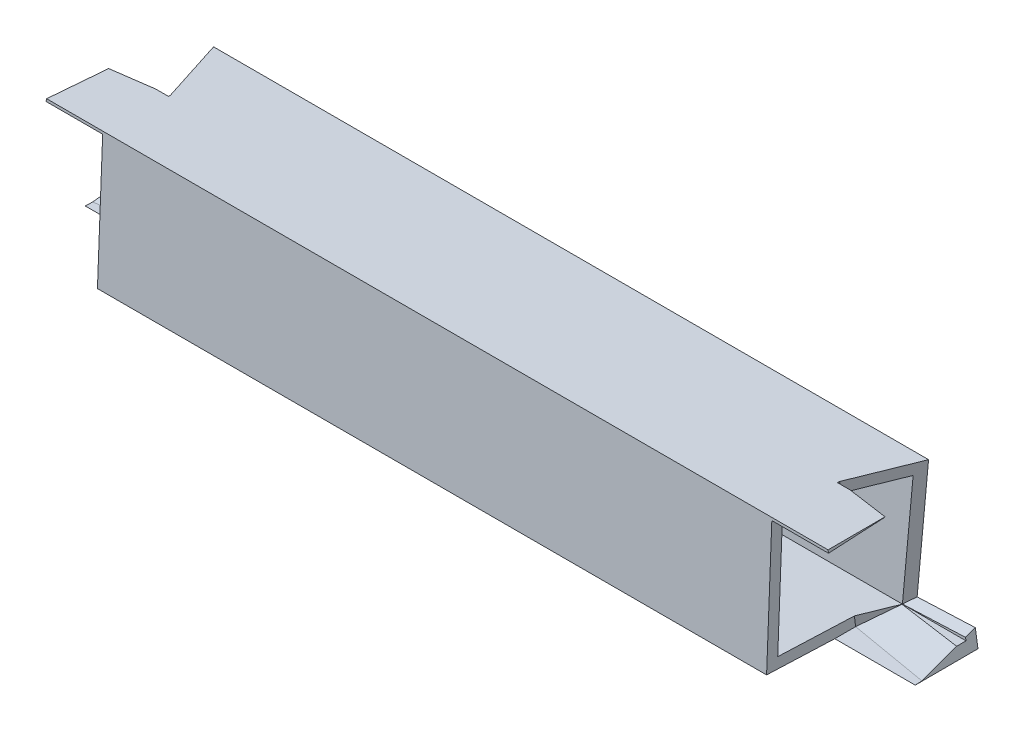
ISO-10303-21;
HEADER;
FILE_DESCRIPTION(('STEP AP214'),'2;1');
FILE_NAME('part.step','',(''),(''),'','','');
FILE_SCHEMA(('AUTOMOTIVE_DESIGN { 1 0 10303 214 1 1 1 1 }'));
ENDSEC;
DATA;
#1=APPLICATION_CONTEXT('core data for automotive mechanical design processes');
#2=APPLICATION_PROTOCOL_DEFINITION('international standard','automotive_design',2000,#1);
#3=PRODUCT_CONTEXT('',#1,'mechanical');
#4=PRODUCT('Part','Part','',(#3));
#5=PRODUCT_RELATED_PRODUCT_CATEGORY('part','',(#4));
#6=PRODUCT_DEFINITION_FORMATION('','',#4);
#7=PRODUCT_DEFINITION_CONTEXT('part definition',#1,'design');
#8=PRODUCT_DEFINITION('design','',#6,#7);
#9=PRODUCT_DEFINITION_SHAPE('','',#8);
#10=(LENGTH_UNIT() NAMED_UNIT(*) SI_UNIT(.MILLI.,.METRE.));
#11=(NAMED_UNIT(*) PLANE_ANGLE_UNIT() SI_UNIT($,.RADIAN.));
#12=(NAMED_UNIT(*) SI_UNIT($,.STERADIAN.) SOLID_ANGLE_UNIT());
#13=UNCERTAINTY_MEASURE_WITH_UNIT(LENGTH_MEASURE(1.E-05),#10,'distance_accuracy_value','');
#14=(GEOMETRIC_REPRESENTATION_CONTEXT(3) GLOBAL_UNCERTAINTY_ASSIGNED_CONTEXT((#13)) GLOBAL_UNIT_ASSIGNED_CONTEXT((#10,
#11,#12)) REPRESENTATION_CONTEXT('',''));
#15=CARTESIAN_POINT('',(0.,0.,0.));
#16=DIRECTION('',(0.,0.,1.));
#17=DIRECTION('',(1.,0.,0.));
#18=AXIS2_PLACEMENT_3D('',#15,#16,#17);
#19=CARTESIAN_POINT('',(60.0000000000013,-90.3909469228951,-1689.59313410964));
#20=DIRECTION('',(0.,0.999204051626855,-0.0398906406626591));
#21=DIRECTION('',(0.,0.0398906406626591,0.999204051626855));
#22=AXIS2_PLACEMENT_3D('',#19,#20,#21);
#23=PLANE('',#22);
#24=DIRECTION('',(0.,-0.0398906406626591,-0.999204051626855));
#25=VECTOR('',#24,1.);
#26=CARTESIAN_POINT('',(50.,-90.3909469228951,-1689.59313410964));
#27=LINE('',#26,#25);
#28=CARTESIAN_POINT('',(50.,-89.593134109642,-1669.60905307711));
#29=VERTEX_POINT('',#28);
#30=CARTESIAN_POINT('',(50.,-89.9999999999999,-1679.80046738785));
#31=VERTEX_POINT('',#30);
#32=EDGE_CURVE('E232',#29,#31,#27,.T.);
#33=ORIENTED_EDGE('',*,*,#32,.F.);
#34=DIRECTION('',(-1.,0.,0.));
#35=VECTOR('',#34,1.);
#36=CARTESIAN_POINT('',(60.0000000000013,-89.593134109642,-1669.6090530771));
#37=LINE('',#36,#35);
#38=CARTESIAN_POINT('',(-50.0000000000002,-89.593134109642,-1669.60905307711));
#39=VERTEX_POINT('',#38);
#40=EDGE_CURVE('E230',#29,#39,#37,.T.);
#41=ORIENTED_EDGE('',*,*,#40,.T.);
#42=DIRECTION('',(0.,0.0398906406626591,0.999204051626855));
#43=VECTOR('',#42,1.);
#44=CARTESIAN_POINT('',(-50.0000000000002,-90.3909469228951,-1689.59313410964));
#45=LINE('',#44,#43);
#46=CARTESIAN_POINT('',(-50.0000000000002,-89.9999999999982,-1679.80046738777));
#47=VERTEX_POINT('',#46);
#48=EDGE_CURVE('E355',#47,#39,#45,.T.);
#49=ORIENTED_EDGE('',*,*,#48,.F.);
#50=DIRECTION('',(1.,0.,0.));
#51=VECTOR('',#50,1.);
#52=CARTESIAN_POINT('',(60.0000000000012,-89.9999999999999,-1679.80046738785));
#53=LINE('',#52,#51);
#54=CARTESIAN_POINT('',(-62.0245373473071,-89.9999999999999,-1679.80046738785));
#55=VERTEX_POINT('',#54);
#56=EDGE_CURVE('E177',#55,#47,#53,.T.);
#57=ORIENTED_EDGE('',*,*,#56,.F.);
#58=DIRECTION('',(-0.0422484460755079,0.039855023737651,0.998311898099525));
#59=VECTOR('',#58,1.);
#60=CARTESIAN_POINT('',(-61.393047120449,-90.5957155900252,-1694.72229920811));
#61=LINE('',#60,#59);
#62=CARTESIAN_POINT('',(-61.610112804518,-90.3909469228951,-1689.59313410964));
#63=VERTEX_POINT('',#62);
#64=EDGE_CURVE('E345',#63,#55,#61,.T.);
#65=ORIENTED_EDGE('',*,*,#64,.F.);
#66=DIRECTION('',(-1.,0.,0.));
#67=VECTOR('',#66,1.);
#68=CARTESIAN_POINT('',(60.0000000000013,-90.3909469228951,-1689.59313410964));
#69=LINE('',#68,#67);
#70=CARTESIAN_POINT('',(61.610112804518,-90.3909469228951,-1689.59313410964));
#71=VERTEX_POINT('',#70);
#72=EDGE_CURVE('E214',#71,#63,#69,.T.);
#73=ORIENTED_EDGE('',*,*,#72,.F.);
#74=DIRECTION('',(-0.0422484460755078,-0.0398550237376509,-0.998311898099525));
#75=VECTOR('',#74,1.);
#76=CARTESIAN_POINT('',(61.6072388639445,-90.393658051479,-1689.66104404091));
#77=LINE('',#76,#75);
#78=CARTESIAN_POINT('',(62.0245373473072,-89.9999999999998,-1679.80046738785));
#79=VERTEX_POINT('',#78);
#80=EDGE_CURVE('E194',#79,#71,#77,.T.);
#81=ORIENTED_EDGE('',*,*,#80,.F.);
#82=DIRECTION('',(1.,0.,0.));
#83=VECTOR('',#82,1.);
#84=CARTESIAN_POINT('',(60.0000000000012,-89.9999999999999,-1679.80046738785));
#85=LINE('',#84,#83);
#86=EDGE_CURVE('E306',#31,#79,#85,.T.);
#87=ORIENTED_EDGE('',*,*,#86,.F.);
#88=EDGE_LOOP('',(#33,#41,#49,#57,#65,#73,#81,#87));
#89=FACE_BOUND('',#88,.T.);
#90=ADVANCED_FACE('F41',(#89),#23,.F.);
#91=CARTESIAN_POINT('',(60.0000000000013,-69.6090530771049,-1670.40686589036));
#92=DIRECTION('',(0.,-0.0398906406626591,-0.999204051626855));
#93=DIRECTION('',(0.,0.999204051626855,-0.0398906406626591));
#94=AXIS2_PLACEMENT_3D('',#91,#92,#93);
#95=PLANE('',#94);
#96=DIRECTION('',(0.,-0.999204051626855,0.0398906406626591));
#97=VECTOR('',#96,1.);
#98=CARTESIAN_POINT('',(50.,-69.6090530771049,-1670.40686589036));
#99=LINE('',#98,#97);
#100=CARTESIAN_POINT('',(50.,-69.9999999999998,-1670.39125834434));
#101=VERTEX_POINT('',#100);
#102=EDGE_CURVE('E329',#101,#29,#99,.T.);
#103=ORIENTED_EDGE('',*,*,#102,.F.);
#104=DIRECTION('',(-1.,0.,0.));
#105=VECTOR('',#104,1.);
#106=CARTESIAN_POINT('',(60.0000000000013,-69.9999999999998,-1670.39125834434));
#107=LINE('',#106,#105);
#108=CARTESIAN_POINT('',(58.4694290318394,-69.9999999999998,-1670.39125834434));
#109=VERTEX_POINT('',#108);
#110=EDGE_CURVE('E300',#109,#101,#107,.T.);
#111=ORIENTED_EDGE('',*,*,#110,.F.);
#112=DIRECTION('',(0.199222248814034,-0.97917434035687,0.0390910061800458));
#113=VECTOR('',#112,1.);
#114=CARTESIAN_POINT('',(58.4537917747577,-69.923143117904,-1670.39432665682));
#115=LINE('',#114,#113);
#116=CARTESIAN_POINT('',(58.389887195482,-69.6090530771049,-1670.40686589036));
#117=VERTEX_POINT('',#116);
#118=EDGE_CURVE('E190',#117,#109,#115,.T.);
#119=ORIENTED_EDGE('',*,*,#118,.F.);
#120=DIRECTION('',(-1.,0.,0.));
#121=VECTOR('',#120,1.);
#122=CARTESIAN_POINT('',(60.0000000000013,-69.6090530771049,-1670.40686589036));
#123=LINE('',#122,#121);
#124=CARTESIAN_POINT('',(-58.389887195482,-69.6090530771049,-1670.40686589036));
#125=VERTEX_POINT('',#124);
#126=EDGE_CURVE('E228',#117,#125,#123,.T.);
#127=ORIENTED_EDGE('',*,*,#126,.T.);
#128=DIRECTION('',(0.199222248814033,0.97917434035687,-0.0390910061800458));
#129=VECTOR('',#128,1.);
#130=CARTESIAN_POINT('',(-53.6910512440551,-46.5143454298763,-1671.32886243597));
#131=LINE('',#130,#129);
#132=CARTESIAN_POINT('',(-58.4694290318394,-69.9999999999998,-1670.39125834434));
#133=VERTEX_POINT('',#132);
#134=EDGE_CURVE('E340',#133,#125,#131,.T.);
#135=ORIENTED_EDGE('',*,*,#134,.F.);
#136=DIRECTION('',(-1.,0.,0.));
#137=VECTOR('',#136,1.);
#138=CARTESIAN_POINT('',(60.0000000000013,-69.9999999999998,-1670.39125834434));
#139=LINE('',#138,#137);
#140=CARTESIAN_POINT('',(-50.0000000000002,-69.9999999999998,-1670.39125834434));
#141=VERTEX_POINT('',#140);
#142=EDGE_CURVE('E385',#141,#133,#139,.T.);
#143=ORIENTED_EDGE('',*,*,#142,.F.);
#144=DIRECTION('',(0.,0.999204051626855,-0.0398906406626591));
#145=VECTOR('',#144,1.);
#146=CARTESIAN_POINT('',(-50.0000000000002,-69.6090530771049,-1670.40686589036));
#147=LINE('',#146,#145);
#148=EDGE_CURVE('E366',#39,#141,#147,.T.);
#149=ORIENTED_EDGE('',*,*,#148,.F.);
#150=ORIENTED_EDGE('',*,*,#40,.F.);
#151=EDGE_LOOP('',(#103,#111,#119,#127,#135,#143,#149,#150));
#152=FACE_BOUND('',#151,.T.);
#153=ADVANCED_FACE('F443',(#152),#95,.F.);
#154=CARTESIAN_POINT('',(60.0000000000013,-70.4068658903581,-1690.39094692289));
#155=DIRECTION('',(0.,-0.999204051626855,0.0398906406626591));
#156=DIRECTION('',(0.,-0.0398906406626591,-0.999204051626855));
#157=AXIS2_PLACEMENT_3D('',#154,#155,#156);
#158=PLANE('',#157);
#159=DIRECTION('',(0.989363980754118,0.00580253399869134,0.145345258558918));
#160=VECTOR('',#159,1.);
#161=CARTESIAN_POINT('',(58.3603807411082,-69.9620058110258,-1679.24783198937));
#162=LINE('',#161,#160);
#163=CARTESIAN_POINT('',(51.8821624218189,-69.9999999999997,-1680.19953261213));
#164=VERTEX_POINT('',#163);
#165=CARTESIAN_POINT('',(58.0135824280842,-69.9640397530746,-1679.29877935703));
#166=VERTEX_POINT('',#165);
#167=EDGE_CURVE('E297',#164,#166,#162,.T.);
#168=ORIENTED_EDGE('',*,*,#167,.F.);
#169=DIRECTION('',(1.,0.,0.));
#170=VECTOR('',#169,1.);
#171=CARTESIAN_POINT('',(60.0000000000012,-69.9999999999998,-1680.19953261214));
#172=LINE('',#171,#170);
#173=CARTESIAN_POINT('',(50.,-69.9999999999998,-1680.19953261214));
#174=VERTEX_POINT('',#173);
#175=EDGE_CURVE('E303',#174,#164,#172,.T.);
#176=ORIENTED_EDGE('',*,*,#175,.F.);
#177=DIRECTION('',(0.,0.0398906406626591,0.999204051626855));
#178=VECTOR('',#177,1.);
#179=CARTESIAN_POINT('',(50.,-70.4068658903581,-1690.39094692289));
#180=LINE('',#179,#178);
#181=CARTESIAN_POINT('',(50.,-70.01297223304,-1680.52446867727));
#182=VERTEX_POINT('',#181);
#183=EDGE_CURVE('E326',#182,#174,#180,.T.);
#184=ORIENTED_EDGE('',*,*,#183,.F.);
#185=DIRECTION('',(-0.327829874094897,0.0376861552041652,0.943984813096509));
#186=VECTOR('',#185,1.);
#187=CARTESIAN_POINT('',(54.1329344053939,-70.4880796584396,-1692.42523679057));
#188=LINE('',#187,#186);
#189=CARTESIAN_POINT('',(53.4264601253643,-70.406865890358,-1690.39094692289));
#190=VERTEX_POINT('',#189);
#191=EDGE_CURVE('E318',#190,#182,#188,.T.);
#192=ORIENTED_EDGE('',*,*,#191,.F.);
#193=DIRECTION('',(-1.,0.,0.));
#194=VECTOR('',#193,1.);
#195=CARTESIAN_POINT('',(60.0000000000013,-70.4068658903581,-1690.39094692289));
#196=LINE('',#195,#194);
#197=CARTESIAN_POINT('',(-53.4264601253647,-70.406865890358,-1690.39094692289));
#198=VERTEX_POINT('',#197);
#199=EDGE_CURVE('E226',#190,#198,#196,.T.);
#200=ORIENTED_EDGE('',*,*,#199,.T.);
#201=DIRECTION('',(-0.327829874094897,-0.0376861552041651,-0.943984813096509));
#202=VECTOR('',#201,1.);
#203=CARTESIAN_POINT('',(-41.2362432435049,-69.0055219565553,-1655.28926609957));
#204=LINE('',#203,#202);
#205=CARTESIAN_POINT('',(-50.0000000000002,-70.01297223304,-1680.52446867727));
#206=VERTEX_POINT('',#205);
#207=EDGE_CURVE('E167',#206,#198,#204,.T.);
#208=ORIENTED_EDGE('',*,*,#207,.F.);
#209=DIRECTION('',(0.,-0.0398906406626591,-0.999204051626855));
#210=VECTOR('',#209,1.);
#211=CARTESIAN_POINT('',(-50.0000000000002,-70.406865890358,-1690.39094692289));
#212=LINE('',#211,#210);
#213=CARTESIAN_POINT('',(-50.0000000000002,-69.9999999999998,-1680.19953261214));
#214=VERTEX_POINT('',#213);
#215=EDGE_CURVE('E369',#214,#206,#212,.T.);
#216=ORIENTED_EDGE('',*,*,#215,.F.);
#217=DIRECTION('',(1.,0.,0.));
#218=VECTOR('',#217,1.);
#219=CARTESIAN_POINT('',(60.0000000000012,-69.9999999999998,-1680.19953261214));
#220=LINE('',#219,#218);
#221=CARTESIAN_POINT('',(-51.882162421728,-70.,-1680.19953261215));
#222=VERTEX_POINT('',#221);
#223=EDGE_CURVE('E186',#222,#214,#220,.T.);
#224=ORIENTED_EDGE('',*,*,#223,.F.);
#225=DIRECTION('',(0.989363980754118,-0.00580253399869154,-0.145345258558917));
#226=VECTOR('',#225,1.);
#227=CARTESIAN_POINT('',(59.1005496285303,-70.6509039872746,-1696.50375562036));
#228=LINE('',#227,#226);
#229=CARTESIAN_POINT('',(-58.0135824280842,-69.9640397530746,-1679.29877935703));
#230=VERTEX_POINT('',#229);
#231=EDGE_CURVE('E388',#230,#222,#228,.T.);
#232=ORIENTED_EDGE('',*,*,#231,.F.);
#233=DIRECTION('',(0.0422484460755079,-0.039855023737651,-0.998311898099525));
#234=VECTOR('',#233,1.);
#235=CARTESIAN_POINT('',(-57.334354913551,-70.6047882593416,-1695.34862194918));
#236=LINE('',#235,#234);
#237=EDGE_CURVE('E356',#125,#230,#236,.T.);
#238=ORIENTED_EDGE('',*,*,#237,.F.);
#239=ORIENTED_EDGE('',*,*,#126,.F.);
#240=DIRECTION('',(0.0422484460755078,0.0398550237376509,0.998311898099525));
#241=VECTOR('',#240,1.);
#242=CARTESIAN_POINT('',(57.5485466570465,-70.4027307207954,-1690.28736678198));
#243=LINE('',#242,#241);
#244=EDGE_CURVE('E202',#166,#117,#243,.T.);
#245=ORIENTED_EDGE('',*,*,#244,.F.);
#246=EDGE_LOOP('',(#168,#176,#184,#192,#200,#208,#216,#224,#232,#238,#239,#245));
#247=FACE_BOUND('',#246,.T.);
#248=ADVANCED_FACE('F407',(#247),#158,.F.);
#249=CARTESIAN_POINT('',(60.0000000000013,-70.4068658903581,-1690.39094692289));
#250=DIRECTION('',(0.,0.0398906406626591,0.999204051626855));
#251=DIRECTION('',(0.,-0.999204051626855,0.0398906406626591));
#252=AXIS2_PLACEMENT_3D('',#249,#250,#251);
#253=PLANE('',#252);
#254=DIRECTION('',(-0.999165767797696,-0.0408058157943469,0.0016290667878585));
#255=VECTOR('',#254,1.);
#256=CARTESIAN_POINT('',(60.7184526064895,-87.9708072738882,-1689.68975193353));
#257=LINE('',#256,#255);
#258=CARTESIAN_POINT('',(61.1144223661874,-87.9546359141448,-1689.6903975333));
#259=VERTEX_POINT('',#258);
#260=CARTESIAN_POINT('',(52.430394748356,-88.3092906098389,-1689.6762388607));
#261=VERTEX_POINT('',#260);
#262=EDGE_CURVE('E294',#259,#261,#257,.T.);
#263=ORIENTED_EDGE('',*,*,#262,.F.);
#264=DIRECTION('',(-0.199222248814034,0.97917434035687,-0.0390910061800458));
#265=VECTOR('',#264,1.);
#266=CARTESIAN_POINT('',(57.6416341044853,-70.8859341220803,-1690.37182136125));
#267=LINE('',#266,#265);
#268=EDGE_CURVE('E200',#71,#259,#267,.T.);
#269=ORIENTED_EDGE('',*,*,#268,.F.);
#270=ORIENTED_EDGE('',*,*,#72,.T.);
#271=DIRECTION('',(-0.199222248814033,-0.97917434035687,0.0390910061800458));
#272=VECTOR('',#271,1.);
#273=CARTESIAN_POINT('',(-52.8788935737827,-47.4771364340526,-1691.3063571404));
#274=LINE('',#273,#272);
#275=CARTESIAN_POINT('',(-61.1144223661874,-87.954635914145,-1689.6903975333));
#276=VERTEX_POINT('',#275);
#277=EDGE_CURVE('E349',#276,#63,#274,.T.);
#278=ORIENTED_EDGE('',*,*,#277,.F.);
#279=DIRECTION('',(-0.999165767797696,0.040805815794347,-0.00162906678785849));
#280=VECTOR('',#279,1.);
#281=CARTESIAN_POINT('',(59.0814151781641,-92.8634201861409,-1689.49442700139));
#282=LINE('',#281,#280);
#283=CARTESIAN_POINT('',(-52.4303947483564,-88.3092906098391,-1689.6762388607));
#284=VERTEX_POINT('',#283);
#285=EDGE_CURVE('E197',#284,#276,#282,.T.);
#286=ORIENTED_EDGE('',*,*,#285,.F.);
#287=DIRECTION('',(0.0555085735732522,-0.997663489384254,0.0398291376946337));
#288=VECTOR('',#287,1.);
#289=CARTESIAN_POINT('',(-53.0769703190488,-76.6882958970794,-1690.14017705578));
#290=LINE('',#289,#288);
#291=EDGE_CURVE('E377',#198,#284,#290,.T.);
#292=ORIENTED_EDGE('',*,*,#291,.F.);
#293=ORIENTED_EDGE('',*,*,#199,.F.);
#294=DIRECTION('',(0.0555085735732523,0.997663489384254,-0.0398291376946337));
#295=VECTOR('',#294,1.);
#296=CARTESIAN_POINT('',(53.4467145278649,-70.0428306328592,-1690.40548009019));
#297=LINE('',#296,#295);
#298=EDGE_CURVE('E315',#261,#190,#297,.T.);
#299=ORIENTED_EDGE('',*,*,#298,.F.);
#300=EDGE_LOOP('',(#263,#269,#270,#278,#286,#292,#293,#299));
#301=FACE_BOUND('',#300,.T.);
#302=ADVANCED_FACE('F507',(#301),#253,.F.);
#303=CARTESIAN_POINT('',(60.0000000000013,-71.9417673479008,-1688.72839541523));
#304=DIRECTION('',(0.,0.0398906406626575,0.999204051626855));
#305=DIRECTION('',(0.,-0.999204051626855,0.0398906406626575));
#306=AXIS2_PLACEMENT_3D('',#303,#304,#305);
#307=PLANE('',#306);
#308=DIRECTION('',(-0.199222248814033,0.97917434035687,-0.0390910061800442));
#309=VECTOR('',#308,1.);
#310=CARTESIAN_POINT('',(58.0189726477677,-72.3441846625475,-1688.71232994345));
#311=LINE('',#310,#309);
#312=CARTESIAN_POINT('',(61.3524947557951,-88.7283954152319,-1688.0582326521));
#313=VERTEX_POINT('',#312);
#314=CARTESIAN_POINT('',(61.2712032248097,-88.3288487696986,-1688.07418351983));
#315=VERTEX_POINT('',#314);
#316=EDGE_CURVE('E210',#313,#315,#311,.T.);
#317=ORIENTED_EDGE('',*,*,#316,.T.);
#318=DIRECTION('',(-0.999165767797696,-0.0408058157943469,0.00162906678785843));
#319=VECTOR('',#318,1.);
#320=CARTESIAN_POINT('',(60.6713153230849,-88.3533481230632,-1688.07320544643));
#321=LINE('',#320,#319);
#322=CARTESIAN_POINT('',(51.8491353939085,-88.7136449433676,-1688.05882152659));
#323=VERTEX_POINT('',#322);
#324=EDGE_CURVE('E291',#315,#323,#321,.T.);
#325=ORIENTED_EDGE('',*,*,#324,.T.);
#326=DIRECTION('',(0.0555085735732518,0.997663489384254,-0.039829137694632));
#327=VECTOR('',#326,1.);
#328=CARTESIAN_POINT('',(52.8045379351234,-71.5420591562237,-1688.74435273228));
#329=LINE('',#328,#327);
#330=CARTESIAN_POINT('',(52.7822987414458,-71.9417673479008,-1688.72839541523));
#331=VERTEX_POINT('',#330);
#332=EDGE_CURVE('E312',#323,#331,#329,.T.);
#333=ORIENTED_EDGE('',*,*,#332,.T.);
#334=DIRECTION('',(-1.,0.,0.));
#335=VECTOR('',#334,1.);
#336=CARTESIAN_POINT('',(60.0000000000013,-71.9417673479008,-1688.72839541523));
#337=LINE('',#336,#335);
#338=CARTESIAN_POINT('',(-52.7822987414461,-71.9417673479007,-1688.72839541523));
#339=VERTEX_POINT('',#338);
#340=EDGE_CURVE('E213',#331,#339,#337,.T.);
#341=ORIENTED_EDGE('',*,*,#340,.T.);
#342=DIRECTION('',(0.0555085735732517,-0.997663489384254,0.039829137694632));
#343=VECTOR('',#342,1.);
#344=CARTESIAN_POINT('',(-52.4347937263073,-78.1875244204438,-1688.47904969787));
#345=LINE('',#344,#343);
#346=CARTESIAN_POINT('',(-51.8491353939088,-88.7136449433678,-1688.05882152659));
#347=VERTEX_POINT('',#346);
#348=EDGE_CURVE('E223',#339,#347,#345,.T.);
#349=ORIENTED_EDGE('',*,*,#348,.T.);
#350=DIRECTION('',(-0.999165767797696,0.040805815794347,-0.00162906678785842));
#351=VECTOR('',#350,1.);
#352=CARTESIAN_POINT('',(59.1285524615686,-93.2459610353159,-1687.87788051429));
#353=LINE('',#352,#351);
#354=CARTESIAN_POINT('',(-61.2712032248097,-88.3288487696988,-1688.07418351983));
#355=VERTEX_POINT('',#354);
#356=EDGE_CURVE('E352',#347,#355,#353,.T.);
#357=ORIENTED_EDGE('',*,*,#356,.T.);
#358=DIRECTION('',(-0.199222248814033,-0.97917434035687,0.0390910061800442));
#359=VECTOR('',#358,1.);
#360=CARTESIAN_POINT('',(-53.2562321170651,-48.9353869745198,-1689.6468657226));
#361=LINE('',#360,#359);
#362=CARTESIAN_POINT('',(-61.3524947557951,-88.7283954152319,-1688.0582326521));
#363=VERTEX_POINT('',#362);
#364=EDGE_CURVE('E221',#355,#363,#361,.T.);
#365=ORIENTED_EDGE('',*,*,#364,.T.);
#366=DIRECTION('',(-1.,0.,0.));
#367=VECTOR('',#366,1.);
#368=CARTESIAN_POINT('',(60.0000000000013,-88.7283954152319,-1688.0582326521));
#369=LINE('',#368,#367);
#370=EDGE_CURVE('E206',#313,#363,#369,.T.);
#371=ORIENTED_EDGE('',*,*,#370,.F.);
#372=EDGE_LOOP('',(#317,#325,#333,#341,#349,#357,#365,#371));
#373=FACE_BOUND('',#372,.T.);
#374=ADVANCED_FACE('F488',(#373),#307,.T.);
#375=CARTESIAN_POINT('',(60.0000000000013,-71.9417673479008,-1688.72839541523));
#376=DIRECTION('',(0.,-0.999204051626855,0.0398906406626591));
#377=DIRECTION('',(0.,-0.0398906406626591,-0.999204051626855));
#378=AXIS2_PLACEMENT_3D('',#375,#376,#377);
#379=PLANE('',#378);
#380=DIRECTION('',(-0.327829874094897,0.0376861552041652,0.943984813096509));
#381=VECTOR('',#380,1.);
#382=CARTESIAN_POINT('',(53.5580026083655,-72.0309395028239,-1690.96203160185));
#383=LINE('',#382,#381);
#384=CARTESIAN_POINT('',(50.,-71.6219241899702,-1680.7167773018));
#385=VERTEX_POINT('',#384);
#386=EDGE_CURVE('E309',#331,#385,#383,.T.);
#387=ORIENTED_EDGE('',*,*,#386,.T.);
#388=DIRECTION('',(0.,0.0398906406626591,0.999204051626855));
#389=VECTOR('',#388,1.);
#390=CARTESIAN_POINT('',(50.,-71.9417673479008,-1688.72839541523));
#391=LINE('',#390,#389);
#392=CARTESIAN_POINT('',(50.,-71.2716045847681,-1671.9417673479));
#393=VERTEX_POINT('',#392);
#394=EDGE_CURVE('E323',#385,#393,#391,.T.);
#395=ORIENTED_EDGE('',*,*,#394,.T.);
#396=DIRECTION('',(-1.,0.,0.));
#397=VECTOR('',#396,1.);
#398=CARTESIAN_POINT('',(60.0000000000013,-71.2716045847681,-1671.9417673479));
#399=LINE('',#398,#397);
#400=CARTESIAN_POINT('',(-50.0000000000002,-71.2716045847681,-1671.9417673479));
#401=VERTEX_POINT('',#400);
#402=EDGE_CURVE('E218',#393,#401,#399,.T.);
#403=ORIENTED_EDGE('',*,*,#402,.T.);
#404=DIRECTION('',(0.,-0.0398906406626591,-0.999204051626855));
#405=VECTOR('',#404,1.);
#406=CARTESIAN_POINT('',(-50.0000000000002,-71.9417673479008,-1688.72839541523));
#407=LINE('',#406,#405);
#408=CARTESIAN_POINT('',(-50.0000000000002,-71.6219241899702,-1680.7167773018));
#409=VERTEX_POINT('',#408);
#410=EDGE_CURVE('E220',#401,#409,#407,.T.);
#411=ORIENTED_EDGE('',*,*,#410,.T.);
#412=DIRECTION('',(-0.327829874094897,-0.0376861552041651,-0.943984813096509));
#413=VECTOR('',#412,1.);
#414=CARTESIAN_POINT('',(-40.6613114464765,-70.5483818009395,-1653.82606091086));
#415=LINE('',#414,#413);
#416=EDGE_CURVE('E217',#409,#339,#415,.T.);
#417=ORIENTED_EDGE('',*,*,#416,.T.);
#418=ORIENTED_EDGE('',*,*,#340,.F.);
#419=EDGE_LOOP('',(#387,#395,#403,#411,#417,#418));
#420=FACE_BOUND('',#419,.T.);
#421=ADVANCED_FACE('F420',(#420),#379,.T.);
#422=CARTESIAN_POINT('',(60.0000000000013,-71.2716045847681,-1671.9417673479));
#423=DIRECTION('',(0.,-0.0398906406626591,-0.999204051626855));
#424=DIRECTION('',(0.,0.999204051626855,-0.0398906406626591));
#425=AXIS2_PLACEMENT_3D('',#422,#423,#424);
#426=PLANE('',#425);
#427=ORIENTED_EDGE('',*,*,#402,.F.);
#428=DIRECTION('',(0.,-0.999204051626855,0.0398906406626591));
#429=VECTOR('',#428,1.);
#430=CARTESIAN_POINT('',(50.,-71.2716045847681,-1671.9417673479));
#431=LINE('',#430,#429);
#432=CARTESIAN_POINT('',(50.,-88.0582326520992,-1671.27160458477));
#433=VERTEX_POINT('',#432);
#434=EDGE_CURVE('E321',#393,#433,#431,.T.);
#435=ORIENTED_EDGE('',*,*,#434,.T.);
#436=DIRECTION('',(-1.,0.,0.));
#437=VECTOR('',#436,1.);
#438=CARTESIAN_POINT('',(60.0000000000013,-88.0582326520992,-1671.27160458477));
#439=LINE('',#438,#437);
#440=CARTESIAN_POINT('',(-50.0000000000002,-88.0582326520992,-1671.27160458477));
#441=VERTEX_POINT('',#440);
#442=EDGE_CURVE('E215',#433,#441,#439,.T.);
#443=ORIENTED_EDGE('',*,*,#442,.T.);
#444=DIRECTION('',(0.,0.999204051626855,-0.0398906406626591));
#445=VECTOR('',#444,1.);
#446=CARTESIAN_POINT('',(-50.0000000000002,-71.2716045847681,-1671.9417673479));
#447=LINE('',#446,#445);
#448=EDGE_CURVE('E207',#441,#401,#447,.T.);
#449=ORIENTED_EDGE('',*,*,#448,.T.);
#450=EDGE_LOOP('',(#427,#435,#443,#449));
#451=FACE_BOUND('',#450,.T.);
#452=ADVANCED_FACE('F424',(#451),#426,.T.);
#453=CARTESIAN_POINT('',(60.0000000000013,-88.7283954152319,-1688.0582326521));
#454=DIRECTION('',(0.,0.999204051626855,-0.0398906406626591));
#455=DIRECTION('',(0.,0.0398906406626591,0.999204051626855));
#456=AXIS2_PLACEMENT_3D('',#453,#454,#455);
#457=PLANE('',#456);
#458=ORIENTED_EDGE('',*,*,#442,.F.);
#459=DIRECTION('',(0.,-0.0398906406626591,-0.999204051626855));
#460=VECTOR('',#459,1.);
#461=CARTESIAN_POINT('',(50.,-88.7283954152319,-1688.0582326521));
#462=LINE('',#461,#460);
#463=CARTESIAN_POINT('',(50.,-88.5159197377379,-1682.73601785942));
#464=VERTEX_POINT('',#463);
#465=EDGE_CURVE('E11',#433,#464,#462,.T.);
#466=ORIENTED_EDGE('',*,*,#465,.T.);
#467=DIRECTION('',(0.327829874094897,-0.0376861552041652,-0.943984813096509));
#468=VECTOR('',#467,1.);
#469=CARTESIAN_POINT('',(52.7243960968584,-88.8291066137885,-1690.58090553903));
#470=LINE('',#469,#468);
#471=CARTESIAN_POINT('',(51.8308222205566,-88.7263845422211,-1688.00786313117));
#472=VERTEX_POINT('',#471);
#473=EDGE_CURVE('E49',#464,#472,#470,.T.);
#474=ORIENTED_EDGE('',*,*,#473,.T.);
#475=DIRECTION('',(0.989363980754118,0.00580253399869134,0.145345258558918));
#476=VECTOR('',#475,1.);
#477=CARTESIAN_POINT('',(59.8198944241843,-88.6795293261618,-1686.83420632976));
#478=LINE('',#477,#476);
#479=CARTESIAN_POINT('',(61.4142074464048,-88.670178818466,-1686.59998935507));
#480=VERTEX_POINT('',#479);
#481=EDGE_CURVE('E252',#472,#480,#478,.T.);
#482=ORIENTED_EDGE('',*,*,#481,.T.);
#483=DIRECTION('',(-0.0422484460755078,-0.0398550237376509,-0.998311898099525));
#484=VECTOR('',#483,1.);
#485=CARTESIAN_POINT('',(61.3500806457134,-88.7306727632423,-1688.11527699436));
#486=LINE('',#485,#484);
#487=EDGE_CURVE('E65',#480,#313,#486,.T.);
#488=ORIENTED_EDGE('',*,*,#487,.T.);
#489=ORIENTED_EDGE('',*,*,#370,.T.);
#490=DIRECTION('',(-0.0422484460755079,0.039855023737651,0.998311898099525));
#491=VECTOR('',#490,1.);
#492=CARTESIAN_POINT('',(-61.1358889022179,-88.9327303017885,-1693.17653216157));
#493=LINE('',#492,#491);
#494=CARTESIAN_POINT('',(-61.4142074464048,-88.670178818466,-1686.59998935507));
#495=VERTEX_POINT('',#494);
#496=EDGE_CURVE('E225',#363,#495,#493,.T.);
#497=ORIENTED_EDGE('',*,*,#496,.T.);
#498=DIRECTION('',(0.989363980754118,-0.00580253399869154,-0.145345258558917));
#499=VECTOR('',#498,1.);
#500=CARTESIAN_POINT('',(57.6410359454543,-89.3684275024106,-1704.09012996075));
#501=LINE('',#500,#499);
#502=CARTESIAN_POINT('',(-51.8308222205572,-88.7263845422212,-1688.00786313117));
#503=VERTEX_POINT('',#502);
#504=EDGE_CURVE('E336',#495,#503,#501,.T.);
#505=ORIENTED_EDGE('',*,*,#504,.T.);
#506=DIRECTION('',(0.327829874094897,0.0376861552041651,0.943984813096509));
#507=VECTOR('',#506,1.);
#508=CARTESIAN_POINT('',(-39.8277049349694,-87.3465489119042,-1653.44493484804));
#509=LINE('',#508,#507);
#510=CARTESIAN_POINT('',(-50.0000000000002,-88.5159197377379,-1682.73601785942));
#511=VERTEX_POINT('',#510);
#512=EDGE_CURVE('E189',#503,#511,#509,.T.);
#513=ORIENTED_EDGE('',*,*,#512,.T.);
#514=DIRECTION('',(0.,0.0398906406626591,0.999204051626855));
#515=VECTOR('',#514,1.);
#516=CARTESIAN_POINT('',(-50.0000000000002,-88.7283954152319,-1688.0582326521));
#517=LINE('',#516,#515);
#518=EDGE_CURVE('E163',#511,#441,#517,.T.);
#519=ORIENTED_EDGE('',*,*,#518,.T.);
#520=EDGE_LOOP('',(#458,#466,#474,#482,#488,#489,#497,#505,#513,#519));
#521=FACE_BOUND('',#520,.T.);
#522=ADVANCED_FACE('F249',(#521),#457,.T.);
#523=CARTESIAN_POINT('',(60.,-80.,-1680.));
#524=DIRECTION('',(0.979114049590753,0.197241393803743,-0.0493103484509357));
#525=DIRECTION('',(-0.197481629250392,0.980306587812512,0.));
#526=AXIS2_PLACEMENT_3D('',#523,#524,#525);
#527=PLANE('',#526);
#528=ORIENTED_EDGE('',*,*,#118,.T.);
#529=DIRECTION('',(-0.0502984641771046,0.,-0.998734231165341));
#530=VECTOR('',#529,1.);
#531=CARTESIAN_POINT('',(57.9906080820513,-69.9999999999998,-1679.89880258006));
#532=LINE('',#531,#530);
#533=CARTESIAN_POINT('',(58.0286483947006,-69.9999999999997,-1679.14346813737));
#534=VERTEX_POINT('',#533);
#535=EDGE_CURVE('E243',#109,#534,#532,.T.);
#536=ORIENTED_EDGE('',*,*,#535,.T.);
#537=DIRECTION('',(-0.0940856984357503,0.224568727252764,-0.969905545963075));
#538=VECTOR('',#537,1.);
#539=CARTESIAN_POINT('',(58.179223923749,-70.3594016463284,-1677.59122328891));
#540=LINE('',#539,#538);
#541=EDGE_CURVE('E240',#534,#166,#540,.T.);
#542=ORIENTED_EDGE('',*,*,#541,.T.);
#543=ORIENTED_EDGE('',*,*,#244,.T.);
#544=EDGE_LOOP('',(#528,#536,#542,#543));
#545=FACE_BOUND('',#544,.T.);
#546=ADVANCED_FACE('F43',(#545),#527,.T.);
#547=ORIENTED_EDGE('',*,*,#268,.T.);
#548=DIRECTION('',(0.0940856984357503,-0.224568727252764,0.969905545963075));
#549=VECTOR('',#548,1.);
#550=CARTESIAN_POINT('',(61.8207760762509,-89.6405983536708,-1682.40877671109));
#551=LINE('',#550,#549);
#552=EDGE_CURVE('E237',#259,#315,#551,.T.);
#553=ORIENTED_EDGE('',*,*,#552,.T.);
#554=ORIENTED_EDGE('',*,*,#316,.F.);
#555=ORIENTED_EDGE('',*,*,#487,.F.);
#556=CARTESIAN_POINT('',(61.9713516052993,-89.9999999999996,-1680.85653186263));
#557=VERTEX_POINT('',#556);
#558=EDGE_CURVE('E204',#480,#557,#551,.T.);
#559=ORIENTED_EDGE('',*,*,#558,.T.);
#560=DIRECTION('',(0.0502984641771046,0.,0.998734231165341));
#561=VECTOR('',#560,1.);
#562=CARTESIAN_POINT('',(62.0093919179487,-89.9999999999999,-1680.10119741994));
#563=LINE('',#562,#561);
#564=EDGE_CURVE('E236',#557,#79,#563,.T.);
#565=ORIENTED_EDGE('',*,*,#564,.T.);
#566=ORIENTED_EDGE('',*,*,#80,.T.);
#567=EDGE_LOOP('',(#547,#553,#554,#555,#559,#565,#566));
#568=FACE_BOUND('',#567,.T.);
#569=ADVANCED_FACE('F502',(#568),#527,.T.);
#570=CARTESIAN_POINT('',(-60.,-80.,-1680.));
#571=DIRECTION('',(-0.979114049590753,0.197241393803743,-0.0493103484509358));
#572=DIRECTION('',(-0.197481629250392,-0.980306587812512,0.));
#573=AXIS2_PLACEMENT_3D('',#570,#571,#572);
#574=PLANE('',#573);
#575=DIRECTION('',(-0.0940856984357504,-0.224568727252764,0.969905545963075));
#576=VECTOR('',#575,1.);
#577=CARTESIAN_POINT('',(-58.179223923749,-70.3594016463287,-1677.59122328891));
#578=LINE('',#577,#576);
#579=CARTESIAN_POINT('',(-58.0286483947006,-69.9999999999998,-1679.14346813737));
#580=VERTEX_POINT('',#579);
#581=EDGE_CURVE('E334',#230,#580,#578,.T.);
#582=ORIENTED_EDGE('',*,*,#581,.T.);
#583=DIRECTION('',(-0.0502984641771047,0.,0.998734231165341));
#584=VECTOR('',#583,1.);
#585=CARTESIAN_POINT('',(-57.9906080820512,-69.9999999999998,-1679.89880258006));
#586=LINE('',#585,#584);
#587=EDGE_CURVE('E337',#580,#133,#586,.T.);
#588=ORIENTED_EDGE('',*,*,#587,.T.);
#589=ORIENTED_EDGE('',*,*,#134,.T.);
#590=ORIENTED_EDGE('',*,*,#237,.T.);
#591=EDGE_LOOP('',(#582,#588,#589,#590));
#592=FACE_BOUND('',#591,.T.);
#593=ADVANCED_FACE('F447',(#592),#574,.T.);
#594=ORIENTED_EDGE('',*,*,#64,.T.);
#595=DIRECTION('',(0.0502984641771047,0.,-0.998734231165341));
#596=VECTOR('',#595,1.);
#597=CARTESIAN_POINT('',(-62.0093919179487,-89.9999999999999,-1680.10119741994));
#598=LINE('',#597,#596);
#599=CARTESIAN_POINT('',(-61.9713516052994,-89.9999999999999,-1680.85653186263));
#600=VERTEX_POINT('',#599);
#601=EDGE_CURVE('E343',#55,#600,#598,.T.);
#602=ORIENTED_EDGE('',*,*,#601,.T.);
#603=DIRECTION('',(0.0940856984357504,0.224568727252764,-0.969905545963075));
#604=VECTOR('',#603,1.);
#605=CARTESIAN_POINT('',(-61.8207760762509,-89.6405983536709,-1682.40877671109));
#606=LINE('',#605,#604);
#607=EDGE_CURVE('E185',#600,#495,#606,.T.);
#608=ORIENTED_EDGE('',*,*,#607,.T.);
#609=ORIENTED_EDGE('',*,*,#496,.F.);
#610=ORIENTED_EDGE('',*,*,#364,.F.);
#611=EDGE_CURVE('E346',#355,#276,#606,.T.);
#612=ORIENTED_EDGE('',*,*,#611,.T.);
#613=ORIENTED_EDGE('',*,*,#277,.T.);
#614=EDGE_LOOP('',(#594,#602,#608,#609,#610,#612,#613));
#615=FACE_BOUND('',#614,.T.);
#616=ADVANCED_FACE('F518',(#615),#574,.T.);
#617=CARTESIAN_POINT('',(-50.0000000000002,-89.9999999999998,-1085.));
#618=DIRECTION('',(-1.,0.,0.));
#619=DIRECTION('',(0.,0.,1.));
#620=AXIS2_PLACEMENT_3D('',#617,#618,#619);
#621=PLANE('',#620);
#622=ORIENTED_EDGE('',*,*,#48,.T.);
#623=ORIENTED_EDGE('',*,*,#148,.T.);
#624=DIRECTION('',(0.,0.,-1.));
#625=VECTOR('',#624,1.);
#626=CARTESIAN_POINT('',(-50.0000000000002,-69.9999999999998,-1085.));
#627=LINE('',#626,#625);
#628=EDGE_CURVE('E368',#141,#214,#627,.T.);
#629=ORIENTED_EDGE('',*,*,#628,.T.);
#630=ORIENTED_EDGE('',*,*,#215,.T.);
#631=DIRECTION('',(0.,-0.992932622114171,-0.118679433523578));
#632=VECTOR('',#631,1.);
#633=CARTESIAN_POINT('',(-50.0000000000002,-19.5414775402697,-1674.49190587711));
#634=LINE('',#633,#632);
#635=EDGE_CURVE('E168',#206,#409,#634,.T.);
#636=ORIENTED_EDGE('',*,*,#635,.T.);
#637=ORIENTED_EDGE('',*,*,#410,.F.);
#638=ORIENTED_EDGE('',*,*,#448,.F.);
#639=ORIENTED_EDGE('',*,*,#518,.F.);
#640=CARTESIAN_POINT('',(-50.0000000000003,-89.9999999999998,-1682.91340130006));
#641=VERTEX_POINT('',#640);
#642=EDGE_CURVE('E155',#511,#641,#634,.T.);
#643=ORIENTED_EDGE('',*,*,#642,.T.);
#644=DIRECTION('',(0.,0.,-1.));
#645=VECTOR('',#644,1.);
#646=CARTESIAN_POINT('',(-50.0000000000002,-89.9999999999998,-1085.));
#647=LINE('',#646,#645);
#648=EDGE_CURVE('E159',#47,#641,#647,.T.);
#649=ORIENTED_EDGE('',*,*,#648,.F.);
#650=EDGE_LOOP('',(#622,#623,#629,#630,#636,#637,#638,#639,#643,#649));
#651=FACE_BOUND('',#650,.T.);
#652=ADVANCED_FACE('F158',(#651),#621,.T.);
#653=CARTESIAN_POINT('',(-50.9591217550329,-89.3327848660641,-1685.5822618358));
#654=DIRECTION('',(-0.94343640931858,-0.0393485848218569,0.3292103133934));
#655=DIRECTION('',(0.329465469723453,0.,0.944167625085665));
#656=AXIS2_PLACEMENT_3D('',#653,#654,#655);
#657=PLANE('',#656);
#658=ORIENTED_EDGE('',*,*,#207,.T.);
#659=ORIENTED_EDGE('',*,*,#291,.T.);
#660=DIRECTION('',(-0.329210313393401,0.229015870186713,-0.916063480746854));
#661=VECTOR('',#660,1.);
#662=CARTESIAN_POINT('',(-50.9591217550329,-89.3327848660641,-1685.5822618358));
#663=LINE('',#662,#661);
#664=EDGE_CURVE('E191',#347,#284,#663,.T.);
#665=ORIENTED_EDGE('',*,*,#664,.F.);
#666=ORIENTED_EDGE('',*,*,#348,.F.);
#667=ORIENTED_EDGE('',*,*,#416,.F.);
#668=ORIENTED_EDGE('',*,*,#635,.F.);
#669=EDGE_LOOP('',(#658,#659,#665,#666,#667,#668));
#670=FACE_BOUND('',#669,.T.);
#671=ADVANCED_FACE('F414',(#670),#657,.T.);
#672=CARTESIAN_POINT('',(-50.0000000000002,-89.9999999999998,-1085.));
#673=DIRECTION('',(0.,1.,0.));
#674=DIRECTION('',(0.,0.,1.));
#675=AXIS2_PLACEMENT_3D('',#672,#673,#674);
#676=PLANE('',#675);
#677=ORIENTED_EDGE('',*,*,#56,.T.);
#678=ORIENTED_EDGE('',*,*,#648,.T.);
#679=DIRECTION('',(-0.985558600813723,0.,0.169334711037329));
#680=VECTOR('',#679,1.);
#681=CARTESIAN_POINT('',(-149.785337570971,-89.9999999999999,-1665.76868632381));
#682=LINE('',#681,#680);
#683=EDGE_CURVE('E174',#641,#600,#682,.T.);
#684=ORIENTED_EDGE('',*,*,#683,.T.);
#685=ORIENTED_EDGE('',*,*,#601,.F.);
#686=EDGE_LOOP('',(#677,#678,#684,#685));
#687=FACE_BOUND('',#686,.T.);
#688=ADVANCED_FACE('F173',(#687),#676,.T.);
#689=CARTESIAN_POINT('',(-50.0000000000002,-69.9999999999998,-1085.));
#690=DIRECTION('',(0.,-1.,0.));
#691=DIRECTION('',(0.,0.,-1.));
#692=AXIS2_PLACEMENT_3D('',#689,#690,#691);
#693=PLANE('',#692);
#694=ORIENTED_EDGE('',*,*,#223,.T.);
#695=ORIENTED_EDGE('',*,*,#628,.F.);
#696=ORIENTED_EDGE('',*,*,#142,.T.);
#697=ORIENTED_EDGE('',*,*,#587,.F.);
#698=DIRECTION('',(0.985558600813723,0.,-0.169334711037329));
#699=VECTOR('',#698,1.);
#700=CARTESIAN_POINT('',(-149.386391562455,-69.9999999999998,-1663.44674850288));
#701=LINE('',#700,#699);
#702=EDGE_CURVE('E387',#580,#222,#701,.T.);
#703=ORIENTED_EDGE('',*,*,#702,.T.);
#704=EDGE_LOOP('',(#694,#695,#696,#697,#703));
#705=FACE_BOUND('',#704,.T.);
#706=ADVANCED_FACE('F400',(#705),#693,.T.);
#707=CARTESIAN_POINT('',(-50.1721500585959,-69.8802434374987,-1681.00194443207));
#708=DIRECTION('',(-0.0393485848218571,-0.972627071428274,-0.229015870186713));
#709=DIRECTION('',(0.,0.229193370242402,-0.973380911584426));
#710=AXIS2_PLACEMENT_3D('',#707,#708,#709);
#711=PLANE('',#710);
#712=ORIENTED_EDGE('',*,*,#231,.T.);
#713=ORIENTED_EDGE('',*,*,#702,.F.);
#714=ORIENTED_EDGE('',*,*,#581,.F.);
#715=EDGE_LOOP('',(#712,#713,#714));
#716=FACE_BOUND('',#715,.T.);
#717=ADVANCED_FACE('F555',(#716),#711,.T.);
#718=CARTESIAN_POINT('',(-50.9591217550329,-89.3327848660641,-1685.5822618358));
#719=DIRECTION('',(0.0393485848218571,0.972627071428274,0.229015870186713));
#720=DIRECTION('',(0.,-0.229193370242402,0.973380911584426));
#721=AXIS2_PLACEMENT_3D('',#718,#719,#720);
#722=PLANE('',#721);
#723=ORIENTED_EDGE('',*,*,#285,.T.);
#724=ORIENTED_EDGE('',*,*,#611,.F.);
#725=ORIENTED_EDGE('',*,*,#356,.F.);
#726=ORIENTED_EDGE('',*,*,#664,.T.);
#727=EDGE_LOOP('',(#723,#724,#725,#726));
#728=FACE_BOUND('',#727,.T.);
#729=ADVANCED_FACE('F514',(#728),#722,.T.);
#730=EDGE_CURVE('E182',#641,#503,#663,.T.);
#731=ORIENTED_EDGE('',*,*,#730,.F.);
#732=ORIENTED_EDGE('',*,*,#642,.F.);
#733=ORIENTED_EDGE('',*,*,#512,.F.);
#734=EDGE_LOOP('',(#731,#732,#733));
#735=FACE_BOUND('',#734,.T.);
#736=ADVANCED_FACE('F188',(#735),#657,.T.);
#737=ORIENTED_EDGE('',*,*,#607,.F.);
#738=ORIENTED_EDGE('',*,*,#683,.F.);
#739=ORIENTED_EDGE('',*,*,#730,.T.);
#740=ORIENTED_EDGE('',*,*,#504,.F.);
#741=EDGE_LOOP('',(#737,#738,#739,#740));
#742=FACE_BOUND('',#741,.T.);
#743=ADVANCED_FACE('F181',(#742),#722,.T.);
#744=CARTESIAN_POINT('',(50.,-89.9999999999998,-1085.));
#745=DIRECTION('',(1.,0.,0.));
#746=DIRECTION('',(0.,0.,-1.));
#747=AXIS2_PLACEMENT_3D('',#744,#745,#746);
#748=PLANE('',#747);
#749=ORIENTED_EDGE('',*,*,#32,.T.);
#750=DIRECTION('',(0.,0.,-1.));
#751=VECTOR('',#750,1.);
#752=CARTESIAN_POINT('',(50.,-89.9999999999998,-1085.));
#753=LINE('',#752,#751);
#754=CARTESIAN_POINT('',(50.,-89.9999999999999,-1682.91340130006));
#755=VERTEX_POINT('',#754);
#756=EDGE_CURVE('E276',#31,#755,#753,.T.);
#757=ORIENTED_EDGE('',*,*,#756,.T.);
#758=DIRECTION('',(0.,0.992932622114171,0.118679433523578));
#759=VECTOR('',#758,1.);
#760=CARTESIAN_POINT('',(50.,-19.5414775402697,-1674.49190587711));
#761=LINE('',#760,#759);
#762=EDGE_CURVE('E263',#755,#464,#761,.T.);
#763=ORIENTED_EDGE('',*,*,#762,.T.);
#764=ORIENTED_EDGE('',*,*,#465,.F.);
#765=ORIENTED_EDGE('',*,*,#434,.F.);
#766=ORIENTED_EDGE('',*,*,#394,.F.);
#767=EDGE_CURVE('E278',#385,#182,#761,.T.);
#768=ORIENTED_EDGE('',*,*,#767,.T.);
#769=ORIENTED_EDGE('',*,*,#183,.T.);
#770=DIRECTION('',(0.,0.,-1.));
#771=VECTOR('',#770,1.);
#772=CARTESIAN_POINT('',(50.,-69.9999999999998,-1085.));
#773=LINE('',#772,#771);
#774=EDGE_CURVE('E287',#101,#174,#773,.T.);
#775=ORIENTED_EDGE('',*,*,#774,.F.);
#776=ORIENTED_EDGE('',*,*,#102,.T.);
#777=EDGE_LOOP('',(#749,#757,#763,#764,#765,#766,#768,#769,#775,#776));
#778=FACE_BOUND('',#777,.T.);
#779=ADVANCED_FACE('F271',(#778),#748,.T.);
#780=CARTESIAN_POINT('',(50.9591217550329,-89.3327848660637,-1685.5822618358));
#781=DIRECTION('',(0.94343640931858,-0.039348584821857,0.329210313393401));
#782=DIRECTION('',(0.329465469723453,0.,-0.944167625085665));
#783=AXIS2_PLACEMENT_3D('',#780,#781,#782);
#784=PLANE('',#783);
#785=ORIENTED_EDGE('',*,*,#191,.T.);
#786=ORIENTED_EDGE('',*,*,#767,.F.);
#787=ORIENTED_EDGE('',*,*,#386,.F.);
#788=ORIENTED_EDGE('',*,*,#332,.F.);
#789=DIRECTION('',(0.329210313393401,0.229015870186713,-0.916063480746854));
#790=VECTOR('',#789,1.);
#791=CARTESIAN_POINT('',(50.9591217550329,-89.3327848660637,-1685.5822618358));
#792=LINE('',#791,#790);
#793=EDGE_CURVE('E499',#323,#261,#792,.T.);
#794=ORIENTED_EDGE('',*,*,#793,.T.);
#795=ORIENTED_EDGE('',*,*,#298,.T.);
#796=EDGE_LOOP('',(#785,#786,#787,#788,#794,#795));
#797=FACE_BOUND('',#796,.T.);
#798=ADVANCED_FACE('F484',(#797),#784,.T.);
#799=CARTESIAN_POINT('',(70.0000000000001,-89.9999999999998,-1085.));
#800=DIRECTION('',(0.,1.,0.));
#801=DIRECTION('',(0.,0.,1.));
#802=AXIS2_PLACEMENT_3D('',#799,#800,#801);
#803=PLANE('',#802);
#804=ORIENTED_EDGE('',*,*,#86,.T.);
#805=ORIENTED_EDGE('',*,*,#564,.F.);
#806=DIRECTION('',(-0.985558600813723,0.,-0.169334711037329));
#807=VECTOR('',#806,1.);
#808=CARTESIAN_POINT('',(169.211852683729,-89.9999999999999,-1662.43090070623));
#809=LINE('',#808,#807);
#810=EDGE_CURVE('E56',#557,#755,#809,.T.);
#811=ORIENTED_EDGE('',*,*,#810,.T.);
#812=ORIENTED_EDGE('',*,*,#756,.F.);
#813=EDGE_LOOP('',(#804,#805,#811,#812));
#814=FACE_BOUND('',#813,.T.);
#815=ADVANCED_FACE('F679',(#814),#803,.T.);
#816=CARTESIAN_POINT('',(70.0000000000001,-69.9999999999998,-1085.));
#817=DIRECTION('',(0.,-1.,0.));
#818=DIRECTION('',(0.,0.,-1.));
#819=AXIS2_PLACEMENT_3D('',#816,#817,#818);
#820=PLANE('',#819);
#821=ORIENTED_EDGE('',*,*,#175,.T.);
#822=DIRECTION('',(0.985558600813723,0.,0.169334711037329));
#823=VECTOR('',#822,1.);
#824=CARTESIAN_POINT('',(168.812906675213,-69.9999999999998,-1660.1089628853));
#825=LINE('',#824,#823);
#826=EDGE_CURVE('E277',#164,#534,#825,.T.);
#827=ORIENTED_EDGE('',*,*,#826,.T.);
#828=ORIENTED_EDGE('',*,*,#535,.F.);
#829=ORIENTED_EDGE('',*,*,#110,.T.);
#830=ORIENTED_EDGE('',*,*,#774,.T.);
#831=EDGE_LOOP('',(#821,#827,#828,#829,#830));
#832=FACE_BOUND('',#831,.T.);
#833=ADVANCED_FACE('F465',(#832),#820,.T.);
#834=CARTESIAN_POINT('',(69.0408782449674,-70.6672151339353,-1674.4177381642));
#835=DIRECTION('',(0.039348584821857,-0.972627071428273,-0.229015870186713));
#836=DIRECTION('',(0.,0.229193370242402,-0.973380911584426));
#837=AXIS2_PLACEMENT_3D('',#834,#835,#836);
#838=PLANE('',#837);
#839=ORIENTED_EDGE('',*,*,#167,.T.);
#840=ORIENTED_EDGE('',*,*,#541,.F.);
#841=ORIENTED_EDGE('',*,*,#826,.F.);
#842=EDGE_LOOP('',(#839,#840,#841));
#843=FACE_BOUND('',#842,.T.);
#844=ADVANCED_FACE('F462',(#843),#838,.T.);
#845=CARTESIAN_POINT('',(69.8278499414044,-90.1197565625008,-1678.99805556793));
#846=DIRECTION('',(-0.039348584821857,0.972627071428273,0.229015870186713));
#847=DIRECTION('',(0.,-0.229193370242402,0.973380911584426));
#848=AXIS2_PLACEMENT_3D('',#845,#846,#847);
#849=PLANE('',#848);
#850=ORIENTED_EDGE('',*,*,#262,.T.);
#851=ORIENTED_EDGE('',*,*,#793,.F.);
#852=ORIENTED_EDGE('',*,*,#324,.F.);
#853=ORIENTED_EDGE('',*,*,#552,.F.);
#854=EDGE_LOOP('',(#850,#851,#852,#853));
#855=FACE_BOUND('',#854,.T.);
#856=ADVANCED_FACE('F496',(#855),#849,.T.);
#857=EDGE_CURVE('E264',#755,#472,#792,.T.);
#858=ORIENTED_EDGE('',*,*,#857,.F.);
#859=ORIENTED_EDGE('',*,*,#810,.F.);
#860=ORIENTED_EDGE('',*,*,#558,.F.);
#861=ORIENTED_EDGE('',*,*,#481,.F.);
#862=EDGE_LOOP('',(#858,#859,#860,#861));
#863=FACE_BOUND('',#862,.T.);
#864=ADVANCED_FACE('F705',(#863),#849,.T.);
#865=ORIENTED_EDGE('',*,*,#762,.F.);
#866=ORIENTED_EDGE('',*,*,#857,.T.);
#867=ORIENTED_EDGE('',*,*,#473,.F.);
#868=EDGE_LOOP('',(#865,#866,#867));
#869=FACE_BOUND('',#868,.T.);
#870=ADVANCED_FACE('F262',(#869),#784,.T.);
#871=CLOSED_SHELL('',(#90,#153,#248,#302,#374,#421,#452,#522,#546,#569,#593,#616,#652,#671,#688,
#706,#717,#729,#736,#743,#779,#798,#815,#833,#844,#856,#864,#870));
#872=MANIFOLD_SOLID_BREP('B2',#871);
#873=ADVANCED_BREP_SHAPE_REPRESENTATION('',(#18,#872),#14);
#874=SHAPE_DEFINITION_REPRESENTATION(#9,#873);
ENDSEC;
END-ISO-10303-21;
